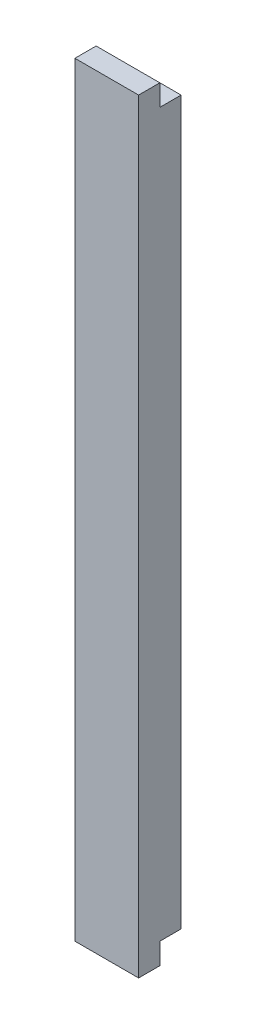
ISO-10303-21;
HEADER;
FILE_DESCRIPTION(('STEP AP214'),'2;1');
FILE_NAME('part.step','',(''),(''),'','','');
FILE_SCHEMA(('AUTOMOTIVE_DESIGN { 1 0 10303 214 1 1 1 1 }'));
ENDSEC;
DATA;
#1=APPLICATION_CONTEXT('core data for automotive mechanical design processes');
#2=APPLICATION_PROTOCOL_DEFINITION('international standard','automotive_design',2000,#1);
#3=PRODUCT_CONTEXT('',#1,'mechanical');
#4=PRODUCT('Part','Part','',(#3));
#5=PRODUCT_RELATED_PRODUCT_CATEGORY('part','',(#4));
#6=PRODUCT_DEFINITION_FORMATION('','',#4);
#7=PRODUCT_DEFINITION_CONTEXT('part definition',#1,'design');
#8=PRODUCT_DEFINITION('design','',#6,#7);
#9=PRODUCT_DEFINITION_SHAPE('','',#8);
#10=(LENGTH_UNIT() NAMED_UNIT(*) SI_UNIT(.MILLI.,.METRE.));
#11=(NAMED_UNIT(*) PLANE_ANGLE_UNIT() SI_UNIT($,.RADIAN.));
#12=(NAMED_UNIT(*) SI_UNIT($,.STERADIAN.) SOLID_ANGLE_UNIT());
#13=UNCERTAINTY_MEASURE_WITH_UNIT(LENGTH_MEASURE(1.E-05),#10,'distance_accuracy_value','');
#14=(GEOMETRIC_REPRESENTATION_CONTEXT(3) GLOBAL_UNCERTAINTY_ASSIGNED_CONTEXT((#13)) GLOBAL_UNIT_ASSIGNED_CONTEXT((#10,
#11,#12)) REPRESENTATION_CONTEXT('',''));
#15=CARTESIAN_POINT('',(0.,0.,0.));
#16=DIRECTION('',(0.,0.,1.));
#17=DIRECTION('',(1.,0.,0.));
#18=AXIS2_PLACEMENT_3D('',#15,#16,#17);
#19=CARTESIAN_POINT('',(20.,-180.,20.));
#20=DIRECTION('',(0.,1.,0.));
#21=DIRECTION('',(0.,0.,1.));
#22=AXIS2_PLACEMENT_3D('',#19,#20,#21);
#23=PLANE('',#22);
#24=DIRECTION('',(-1.,0.,0.));
#25=VECTOR('',#24,1.);
#26=CARTESIAN_POINT('',(20.,-180.,10.));
#27=LINE('',#26,#25);
#28=CARTESIAN_POINT('',(20.,-180.,10.));
#29=VERTEX_POINT('',#28);
#30=CARTESIAN_POINT('',(-10.,-180.,10.));
#31=VERTEX_POINT('',#30);
#32=EDGE_CURVE('E204',#29,#31,#27,.T.);
#33=ORIENTED_EDGE('',*,*,#32,.F.);
#34=DIRECTION('',(0.,0.,-1.));
#35=VECTOR('',#34,1.);
#36=CARTESIAN_POINT('',(20.,-180.,20.));
#37=LINE('',#36,#35);
#38=CARTESIAN_POINT('',(20.,-180.,20.));
#39=VERTEX_POINT('',#38);
#40=EDGE_CURVE('E50',#39,#29,#37,.T.);
#41=ORIENTED_EDGE('',*,*,#40,.F.);
#42=DIRECTION('',(1.,0.,0.));
#43=VECTOR('',#42,1.);
#44=CARTESIAN_POINT('',(20.,-180.,20.));
#45=LINE('',#44,#43);
#46=CARTESIAN_POINT('',(-10.,-180.,20.));
#47=VERTEX_POINT('',#46);
#48=EDGE_CURVE('E174',#47,#39,#45,.T.);
#49=ORIENTED_EDGE('',*,*,#48,.F.);
#50=DIRECTION('',(0.,0.,1.));
#51=VECTOR('',#50,1.);
#52=CARTESIAN_POINT('',(-10.,-180.,10.));
#53=LINE('',#52,#51);
#54=EDGE_CURVE('E166',#31,#47,#53,.T.);
#55=ORIENTED_EDGE('',*,*,#54,.F.);
#56=EDGE_LOOP('',(#33,#41,#49,#55));
#57=FACE_BOUND('',#56,.T.);
#58=ADVANCED_FACE('F41',(#57),#23,.F.);
#59=CARTESIAN_POINT('',(-20.,180.,20.));
#60=DIRECTION('',(0.,-1.,0.));
#61=DIRECTION('',(0.,0.,-1.));
#62=AXIS2_PLACEMENT_3D('',#59,#60,#61);
#63=PLANE('',#62);
#64=DIRECTION('',(1.,0.,0.));
#65=VECTOR('',#64,1.);
#66=CARTESIAN_POINT('',(-20.,180.,10.));
#67=LINE('',#66,#65);
#68=CARTESIAN_POINT('',(-10.,180.,10.));
#69=VERTEX_POINT('',#68);
#70=CARTESIAN_POINT('',(20.,180.,10.));
#71=VERTEX_POINT('',#70);
#72=EDGE_CURVE('E218',#69,#71,#67,.T.);
#73=ORIENTED_EDGE('',*,*,#72,.F.);
#74=DIRECTION('',(0.,0.,1.));
#75=VECTOR('',#74,1.);
#76=CARTESIAN_POINT('',(-10.,180.,10.));
#77=LINE('',#76,#75);
#78=CARTESIAN_POINT('',(-10.,180.,20.));
#79=VERTEX_POINT('',#78);
#80=EDGE_CURVE('E168',#69,#79,#77,.T.);
#81=ORIENTED_EDGE('',*,*,#80,.T.);
#82=DIRECTION('',(-1.,0.,0.));
#83=VECTOR('',#82,1.);
#84=CARTESIAN_POINT('',(-20.,180.,20.));
#85=LINE('',#84,#83);
#86=CARTESIAN_POINT('',(20.,180.,20.));
#87=VERTEX_POINT('',#86);
#88=EDGE_CURVE('E180',#87,#79,#85,.T.);
#89=ORIENTED_EDGE('',*,*,#88,.F.);
#90=DIRECTION('',(0.,0.,-1.));
#91=VECTOR('',#90,1.);
#92=CARTESIAN_POINT('',(20.,180.,20.));
#93=LINE('',#92,#91);
#94=EDGE_CURVE('E184',#87,#71,#93,.T.);
#95=ORIENTED_EDGE('',*,*,#94,.T.);
#96=EDGE_LOOP('',(#73,#81,#89,#95));
#97=FACE_BOUND('',#96,.T.);
#98=ADVANCED_FACE('F254',(#97),#63,.F.);
#99=CARTESIAN_POINT('',(-20.,-180.,20.));
#100=DIRECTION('',(1.,0.,0.));
#101=DIRECTION('',(0.,0.,-1.));
#102=AXIS2_PLACEMENT_3D('',#99,#100,#101);
#103=PLANE('',#102);
#104=DIRECTION('',(0.,-1.,0.));
#105=VECTOR('',#104,1.);
#106=CARTESIAN_POINT('',(-20.,-180.,0.));
#107=LINE('',#106,#105);
#108=CARTESIAN_POINT('',(-20.,170.,0.));
#109=VERTEX_POINT('',#108);
#110=CARTESIAN_POINT('',(-20.,-170.,0.));
#111=VERTEX_POINT('',#110);
#112=EDGE_CURVE('E145',#109,#111,#107,.T.);
#113=ORIENTED_EDGE('',*,*,#112,.T.);
#114=DIRECTION('',(0.,0.,-1.));
#115=VECTOR('',#114,1.);
#116=CARTESIAN_POINT('',(-20.,-170.,10.));
#117=LINE('',#116,#115);
#118=CARTESIAN_POINT('',(-20.,-170.,10.));
#119=VERTEX_POINT('',#118);
#120=EDGE_CURVE('E131',#119,#111,#117,.T.);
#121=ORIENTED_EDGE('',*,*,#120,.F.);
#122=DIRECTION('',(0.,-1.,0.));
#123=VECTOR('',#122,1.);
#124=CARTESIAN_POINT('',(-20.,180.,10.));
#125=LINE('',#124,#123);
#126=CARTESIAN_POINT('',(-20.,170.,10.));
#127=VERTEX_POINT('',#126);
#128=EDGE_CURVE('E143',#127,#119,#125,.T.);
#129=ORIENTED_EDGE('',*,*,#128,.F.);
#130=DIRECTION('',(0.,0.,-1.));
#131=VECTOR('',#130,1.);
#132=CARTESIAN_POINT('',(-20.,170.,10.));
#133=LINE('',#132,#131);
#134=EDGE_CURVE('E70',#127,#109,#133,.T.);
#135=ORIENTED_EDGE('',*,*,#134,.T.);
#136=EDGE_LOOP('',(#113,#121,#129,#135));
#137=FACE_BOUND('',#136,.T.);
#138=ADVANCED_FACE('F43',(#137),#103,.F.);
#139=CARTESIAN_POINT('',(20.,180.,20.));
#140=DIRECTION('',(-1.,0.,0.));
#141=DIRECTION('',(0.,0.,1.));
#142=AXIS2_PLACEMENT_3D('',#139,#140,#141);
#143=PLANE('',#142);
#144=DIRECTION('',(0.,-1.,0.));
#145=VECTOR('',#144,1.);
#146=CARTESIAN_POINT('',(20.,-170.,10.));
#147=LINE('',#146,#145);
#148=CARTESIAN_POINT('',(20.,-170.,10.));
#149=VERTEX_POINT('',#148);
#150=EDGE_CURVE('E138',#149,#29,#147,.T.);
#151=ORIENTED_EDGE('',*,*,#150,.F.);
#152=DIRECTION('',(0.,0.,-1.));
#153=VECTOR('',#152,1.);
#154=CARTESIAN_POINT('',(20.,-170.,10.));
#155=LINE('',#154,#153);
#156=CARTESIAN_POINT('',(20.,-170.,0.));
#157=VERTEX_POINT('',#156);
#158=EDGE_CURVE('E147',#149,#157,#155,.T.);
#159=ORIENTED_EDGE('',*,*,#158,.T.);
#160=DIRECTION('',(0.,1.,0.));
#161=VECTOR('',#160,1.);
#162=CARTESIAN_POINT('',(20.,180.,0.));
#163=LINE('',#162,#161);
#164=CARTESIAN_POINT('',(20.,170.,0.));
#165=VERTEX_POINT('',#164);
#166=EDGE_CURVE('E178',#157,#165,#163,.T.);
#167=ORIENTED_EDGE('',*,*,#166,.T.);
#168=DIRECTION('',(0.,0.,-1.));
#169=VECTOR('',#168,1.);
#170=CARTESIAN_POINT('',(20.,170.,10.));
#171=LINE('',#170,#169);
#172=CARTESIAN_POINT('',(20.,170.,10.));
#173=VERTEX_POINT('',#172);
#174=EDGE_CURVE('E163',#173,#165,#171,.T.);
#175=ORIENTED_EDGE('',*,*,#174,.F.);
#176=DIRECTION('',(0.,-1.,0.));
#177=VECTOR('',#176,1.);
#178=CARTESIAN_POINT('',(20.,180.,10.));
#179=LINE('',#178,#177);
#180=EDGE_CURVE('E221',#71,#173,#179,.T.);
#181=ORIENTED_EDGE('',*,*,#180,.F.);
#182=ORIENTED_EDGE('',*,*,#94,.F.);
#183=DIRECTION('',(0.,1.,0.));
#184=VECTOR('',#183,1.);
#185=CARTESIAN_POINT('',(20.,180.,20.));
#186=LINE('',#185,#184);
#187=EDGE_CURVE('E177',#39,#87,#186,.T.);
#188=ORIENTED_EDGE('',*,*,#187,.F.);
#189=ORIENTED_EDGE('',*,*,#40,.T.);
#190=EDGE_LOOP('',(#151,#159,#167,#175,#181,#182,#188,#189));
#191=FACE_BOUND('',#190,.T.);
#192=ADVANCED_FACE('F197',(#191),#143,.F.);
#193=CARTESIAN_POINT('',(0.,0.,20.));
#194=DIRECTION('',(0.,0.,-1.));
#195=DIRECTION('',(-1.,0.,0.));
#196=AXIS2_PLACEMENT_3D('',#193,#194,#195);
#197=PLANE('',#196);
#198=ORIENTED_EDGE('',*,*,#88,.T.);
#199=DIRECTION('',(0.,1.,0.));
#200=VECTOR('',#199,1.);
#201=CARTESIAN_POINT('',(-10.,180.,20.));
#202=LINE('',#201,#200);
#203=EDGE_CURVE('E152',#47,#79,#202,.T.);
#204=ORIENTED_EDGE('',*,*,#203,.F.);
#205=ORIENTED_EDGE('',*,*,#48,.T.);
#206=ORIENTED_EDGE('',*,*,#187,.T.);
#207=EDGE_LOOP('',(#198,#204,#205,#206));
#208=FACE_BOUND('',#207,.T.);
#209=ADVANCED_FACE('F242',(#208),#197,.F.);
#210=CARTESIAN_POINT('',(0.,0.,0.));
#211=DIRECTION('',(0.,0.,-1.));
#212=DIRECTION('',(-1.,0.,0.));
#213=AXIS2_PLACEMENT_3D('',#210,#211,#212);
#214=PLANE('',#213);
#215=DIRECTION('',(1.,0.,0.));
#216=VECTOR('',#215,1.);
#217=CARTESIAN_POINT('',(-20.,-170.,0.));
#218=LINE('',#217,#216);
#219=EDGE_CURVE('E208',#111,#157,#218,.T.);
#220=ORIENTED_EDGE('',*,*,#219,.F.);
#221=ORIENTED_EDGE('',*,*,#112,.F.);
#222=DIRECTION('',(-1.,0.,0.));
#223=VECTOR('',#222,1.);
#224=CARTESIAN_POINT('',(20.,170.,0.));
#225=LINE('',#224,#223);
#226=EDGE_CURVE('E222',#165,#109,#225,.T.);
#227=ORIENTED_EDGE('',*,*,#226,.F.);
#228=ORIENTED_EDGE('',*,*,#166,.F.);
#229=EDGE_LOOP('',(#220,#221,#227,#228));
#230=FACE_BOUND('',#229,.T.);
#231=ADVANCED_FACE('F239',(#230),#214,.T.);
#232=CARTESIAN_POINT('',(-10.,180.,10.));
#233=DIRECTION('',(1.,0.,0.));
#234=DIRECTION('',(0.,1.,0.));
#235=AXIS2_PLACEMENT_3D('',#232,#233,#234);
#236=PLANE('',#235);
#237=ORIENTED_EDGE('',*,*,#203,.T.);
#238=ORIENTED_EDGE('',*,*,#80,.F.);
#239=DIRECTION('',(0.,1.,0.));
#240=VECTOR('',#239,1.);
#241=CARTESIAN_POINT('',(-10.,180.,10.));
#242=LINE('',#241,#240);
#243=CARTESIAN_POINT('',(-10.,170.,10.));
#244=VERTEX_POINT('',#243);
#245=EDGE_CURVE('E151',#244,#69,#242,.T.);
#246=ORIENTED_EDGE('',*,*,#245,.F.);
#247=CARTESIAN_POINT('',(-10.,-170.,10.));
#248=VERTEX_POINT('',#247);
#249=EDGE_CURVE('E157',#248,#244,#242,.T.);
#250=ORIENTED_EDGE('',*,*,#249,.F.);
#251=EDGE_CURVE('E159',#31,#248,#242,.T.);
#252=ORIENTED_EDGE('',*,*,#251,.F.);
#253=ORIENTED_EDGE('',*,*,#54,.T.);
#254=EDGE_LOOP('',(#237,#238,#246,#250,#252,#253));
#255=FACE_BOUND('',#254,.T.);
#256=ADVANCED_FACE('F241',(#255),#236,.F.);
#257=CARTESIAN_POINT('',(0.,0.,10.));
#258=DIRECTION('',(0.,0.,1.));
#259=DIRECTION('',(1.,0.,0.));
#260=AXIS2_PLACEMENT_3D('',#257,#258,#259);
#261=PLANE('',#260);
#262=DIRECTION('',(1.,0.,0.));
#263=VECTOR('',#262,1.);
#264=CARTESIAN_POINT('',(-20.,-170.,10.));
#265=LINE('',#264,#263);
#266=EDGE_CURVE('E128',#119,#248,#265,.T.);
#267=ORIENTED_EDGE('',*,*,#266,.T.);
#268=ORIENTED_EDGE('',*,*,#249,.T.);
#269=DIRECTION('',(1.,0.,0.));
#270=VECTOR('',#269,1.);
#271=CARTESIAN_POINT('',(0.,170.,10.));
#272=LINE('',#271,#270);
#273=EDGE_CURVE('E11',#127,#244,#272,.T.);
#274=ORIENTED_EDGE('',*,*,#273,.F.);
#275=ORIENTED_EDGE('',*,*,#128,.T.);
#276=EDGE_LOOP('',(#267,#268,#274,#275));
#277=FACE_BOUND('',#276,.T.);
#278=ADVANCED_FACE('F149',(#277),#261,.T.);
#279=CARTESIAN_POINT('',(0.,0.,10.));
#280=DIRECTION('',(0.,0.,-1.));
#281=DIRECTION('',(-1.,0.,0.));
#282=AXIS2_PLACEMENT_3D('',#279,#280,#281);
#283=PLANE('',#282);
#284=ORIENTED_EDGE('',*,*,#245,.T.);
#285=ORIENTED_EDGE('',*,*,#72,.T.);
#286=ORIENTED_EDGE('',*,*,#180,.T.);
#287=DIRECTION('',(-1.,0.,0.));
#288=VECTOR('',#287,1.);
#289=CARTESIAN_POINT('',(20.,170.,10.));
#290=LINE('',#289,#288);
#291=EDGE_CURVE('E226',#173,#244,#290,.T.);
#292=ORIENTED_EDGE('',*,*,#291,.T.);
#293=EDGE_LOOP('',(#284,#285,#286,#292));
#294=FACE_BOUND('',#293,.T.);
#295=ADVANCED_FACE('F277',(#294),#283,.T.);
#296=CARTESIAN_POINT('',(20.,170.,10.));
#297=DIRECTION('',(0.,-1.,0.));
#298=DIRECTION('',(0.,0.,-1.));
#299=AXIS2_PLACEMENT_3D('',#296,#297,#298);
#300=PLANE('',#299);
#301=ORIENTED_EDGE('',*,*,#226,.T.);
#302=ORIENTED_EDGE('',*,*,#134,.F.);
#303=ORIENTED_EDGE('',*,*,#273,.T.);
#304=ORIENTED_EDGE('',*,*,#291,.F.);
#305=ORIENTED_EDGE('',*,*,#174,.T.);
#306=EDGE_LOOP('',(#301,#302,#303,#304,#305));
#307=FACE_BOUND('',#306,.T.);
#308=ADVANCED_FACE('F235',(#307),#300,.F.);
#309=CARTESIAN_POINT('',(0.,0.,10.));
#310=DIRECTION('',(0.,0.,-1.));
#311=DIRECTION('',(-1.,0.,0.));
#312=AXIS2_PLACEMENT_3D('',#309,#310,#311);
#313=PLANE('',#312);
#314=ORIENTED_EDGE('',*,*,#251,.T.);
#315=EDGE_CURVE('E60',#248,#149,#265,.T.);
#316=ORIENTED_EDGE('',*,*,#315,.T.);
#317=ORIENTED_EDGE('',*,*,#150,.T.);
#318=ORIENTED_EDGE('',*,*,#32,.T.);
#319=EDGE_LOOP('',(#314,#316,#317,#318));
#320=FACE_BOUND('',#319,.T.);
#321=ADVANCED_FACE('F290',(#320),#313,.T.);
#322=CARTESIAN_POINT('',(-20.,-170.,10.));
#323=DIRECTION('',(0.,1.,0.));
#324=DIRECTION('',(0.,0.,1.));
#325=AXIS2_PLACEMENT_3D('',#322,#323,#324);
#326=PLANE('',#325);
#327=ORIENTED_EDGE('',*,*,#219,.T.);
#328=ORIENTED_EDGE('',*,*,#158,.F.);
#329=ORIENTED_EDGE('',*,*,#315,.F.);
#330=ORIENTED_EDGE('',*,*,#266,.F.);
#331=ORIENTED_EDGE('',*,*,#120,.T.);
#332=EDGE_LOOP('',(#327,#328,#329,#330,#331));
#333=FACE_BOUND('',#332,.T.);
#334=ADVANCED_FACE('F130',(#333),#326,.F.);
#335=CLOSED_SHELL('',(#58,#98,#138,#192,#209,#231,#256,#278,#295,#308,#321,#334));
#336=MANIFOLD_SOLID_BREP('B2',#335);
#337=ADVANCED_BREP_SHAPE_REPRESENTATION('',(#18,#336),#14);
#338=SHAPE_DEFINITION_REPRESENTATION(#9,#337);
ENDSEC;
END-ISO-10303-21;
